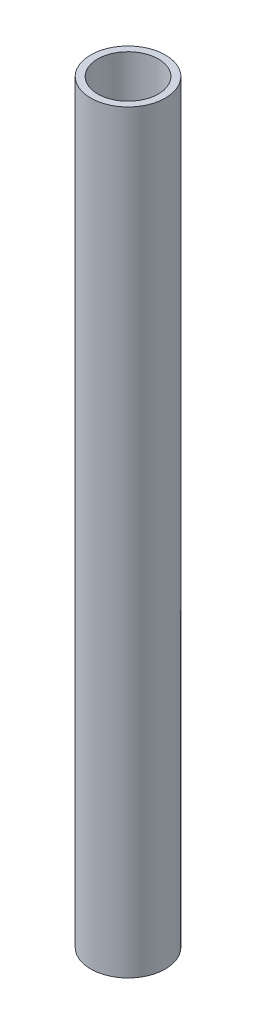
ISO-10303-21;
HEADER;
FILE_DESCRIPTION(('STEP AP214'),'2;1');
FILE_NAME('part.step','',(''),(''),'','','');
FILE_SCHEMA(('AUTOMOTIVE_DESIGN { 1 0 10303 214 1 1 1 1 }'));
ENDSEC;
DATA;
#1=APPLICATION_CONTEXT('core data for automotive mechanical design processes');
#2=APPLICATION_PROTOCOL_DEFINITION('international standard','automotive_design',2000,#1);
#3=PRODUCT_CONTEXT('',#1,'mechanical');
#4=PRODUCT('Part','Part','',(#3));
#5=PRODUCT_RELATED_PRODUCT_CATEGORY('part','',(#4));
#6=PRODUCT_DEFINITION_FORMATION('','',#4);
#7=PRODUCT_DEFINITION_CONTEXT('part definition',#1,'design');
#8=PRODUCT_DEFINITION('design','',#6,#7);
#9=PRODUCT_DEFINITION_SHAPE('','',#8);
#10=(LENGTH_UNIT() NAMED_UNIT(*) SI_UNIT(.MILLI.,.METRE.));
#11=(NAMED_UNIT(*) PLANE_ANGLE_UNIT() SI_UNIT($,.RADIAN.));
#12=(NAMED_UNIT(*) SI_UNIT($,.STERADIAN.) SOLID_ANGLE_UNIT());
#13=UNCERTAINTY_MEASURE_WITH_UNIT(LENGTH_MEASURE(1.E-05),#10,'distance_accuracy_value','');
#14=(GEOMETRIC_REPRESENTATION_CONTEXT(3) GLOBAL_UNCERTAINTY_ASSIGNED_CONTEXT((#13)) GLOBAL_UNIT_ASSIGNED_CONTEXT((#10,
#11,#12)) REPRESENTATION_CONTEXT('',''));
#15=CARTESIAN_POINT('',(0.,0.,0.));
#16=DIRECTION('',(0.,0.,1.));
#17=DIRECTION('',(1.,0.,0.));
#18=AXIS2_PLACEMENT_3D('',#15,#16,#17);
#19=CARTESIAN_POINT('',(0.,215.,1.50000000000001));
#20=DIRECTION('',(0.,1.,0.));
#21=DIRECTION('',(0.,0.,1.));
#22=AXIS2_PLACEMENT_3D('',#19,#20,#21);
#23=PLANE('',#22);
#24=CARTESIAN_POINT('',(0.,215.,1.50000000000001));
#25=DIRECTION('',(0.,1.,0.));
#26=DIRECTION('',(0.,0.,1.));
#27=AXIS2_PLACEMENT_3D('',#24,#25,#26);
#28=CIRCLE('',#27,10.65);
#29=CARTESIAN_POINT('',(0.,215.,-9.14999999999999));
#30=VERTEX_POINT('',#29);
#31=EDGE_CURVE('E10',#30,#30,#28,.T.);
#32=ORIENTED_EDGE('',*,*,#31,.T.);
#33=EDGE_LOOP('',(#32));
#34=FACE_BOUND('',#33,.T.);
#35=CARTESIAN_POINT('',(0.,215.,1.50000000000001));
#36=DIRECTION('',(0.,1.,0.));
#37=DIRECTION('',(0.,0.,1.));
#38=AXIS2_PLACEMENT_3D('',#35,#36,#37);
#39=CIRCLE('',#38,8.65);
#40=CARTESIAN_POINT('',(0.,215.,-7.14999999999999));
#41=VERTEX_POINT('',#40);
#42=EDGE_CURVE('E44',#41,#41,#39,.T.);
#43=ORIENTED_EDGE('',*,*,#42,.F.);
#44=EDGE_LOOP('',(#43));
#45=FACE_BOUND('',#44,.T.);
#46=ADVANCED_FACE('F33',(#34,#45),#23,.T.);
#47=CARTESIAN_POINT('',(0.,0.,1.50000000000001));
#48=DIRECTION('',(0.,1.,0.));
#49=DIRECTION('',(0.,0.,1.));
#50=AXIS2_PLACEMENT_3D('',#47,#48,#49);
#51=PLANE('',#50);
#52=CARTESIAN_POINT('',(0.,0.,1.50000000000001));
#53=DIRECTION('',(0.,1.,0.));
#54=DIRECTION('',(0.,0.,1.));
#55=AXIS2_PLACEMENT_3D('',#52,#53,#54);
#56=CIRCLE('',#55,10.65);
#57=CARTESIAN_POINT('',(0.,0.,-9.14999999999999));
#58=VERTEX_POINT('',#57);
#59=EDGE_CURVE('E37',#58,#58,#56,.T.);
#60=ORIENTED_EDGE('',*,*,#59,.F.);
#61=EDGE_LOOP('',(#60));
#62=FACE_BOUND('',#61,.T.);
#63=CARTESIAN_POINT('',(0.,0.,1.50000000000001));
#64=DIRECTION('',(0.,1.,0.));
#65=DIRECTION('',(0.,0.,1.));
#66=AXIS2_PLACEMENT_3D('',#63,#64,#65);
#67=CIRCLE('',#66,8.65);
#68=CARTESIAN_POINT('',(0.,0.,-7.14999999999999));
#69=VERTEX_POINT('',#68);
#70=EDGE_CURVE('E46',#69,#69,#67,.T.);
#71=ORIENTED_EDGE('',*,*,#70,.T.);
#72=EDGE_LOOP('',(#71));
#73=FACE_BOUND('',#72,.T.);
#74=ADVANCED_FACE('F56',(#62,#73),#51,.F.);
#75=CARTESIAN_POINT('',(0.,215.,1.50000000000001));
#76=DIRECTION('',(0.,-1.,0.));
#77=DIRECTION('',(0.,0.,-1.));
#78=AXIS2_PLACEMENT_3D('',#75,#76,#77);
#79=CYLINDRICAL_SURFACE('',#78,10.65);
#80=CARTESIAN_POINT('',(0.,215.,-9.14999999999999));
#81=CARTESIAN_POINT('',(0.,212.760416666667,-9.14999999999999));
#82=CARTESIAN_POINT('',(0.,210.520833333333,-9.14999999999999));
#83=CARTESIAN_POINT('',(0.,206.041666666667,-9.14999999999999));
#84=CARTESIAN_POINT('',(0.,203.802083333333,-9.14999999999999));
#85=CARTESIAN_POINT('',(0.,199.322916666667,-9.14999999999999));
#86=CARTESIAN_POINT('',(0.,197.083333333333,-9.14999999999999));
#87=CARTESIAN_POINT('',(0.,192.604166666667,-9.14999999999999));
#88=CARTESIAN_POINT('',(0.,190.364583333333,-9.14999999999999));
#89=CARTESIAN_POINT('',(0.,185.885416666667,-9.14999999999999));
#90=CARTESIAN_POINT('',(0.,183.645833333333,-9.14999999999999));
#91=CARTESIAN_POINT('',(0.,179.166666666667,-9.14999999999999));
#92=CARTESIAN_POINT('',(0.,176.927083333333,-9.14999999999999));
#93=CARTESIAN_POINT('',(0.,172.447916666667,-9.14999999999999));
#94=CARTESIAN_POINT('',(0.,170.208333333333,-9.14999999999999));
#95=CARTESIAN_POINT('',(0.,165.729166666667,-9.14999999999999));
#96=CARTESIAN_POINT('',(0.,163.489583333333,-9.14999999999999));
#97=CARTESIAN_POINT('',(0.,159.010416666667,-9.14999999999999));
#98=CARTESIAN_POINT('',(0.,156.770833333333,-9.14999999999999));
#99=CARTESIAN_POINT('',(0.,152.291666666667,-9.14999999999999));
#100=CARTESIAN_POINT('',(0.,150.052083333333,-9.14999999999999));
#101=CARTESIAN_POINT('',(0.,145.572916666667,-9.14999999999999));
#102=CARTESIAN_POINT('',(0.,143.333333333333,-9.14999999999999));
#103=CARTESIAN_POINT('',(0.,138.854166666667,-9.14999999999999));
#104=CARTESIAN_POINT('',(0.,136.614583333333,-9.14999999999999));
#105=CARTESIAN_POINT('',(0.,132.135416666667,-9.14999999999999));
#106=CARTESIAN_POINT('',(0.,129.895833333333,-9.14999999999999));
#107=CARTESIAN_POINT('',(0.,125.416666666667,-9.14999999999999));
#108=CARTESIAN_POINT('',(0.,123.177083333333,-9.14999999999999));
#109=CARTESIAN_POINT('',(0.,118.697916666667,-9.14999999999999));
#110=CARTESIAN_POINT('',(0.,116.458333333333,-9.14999999999999));
#111=CARTESIAN_POINT('',(0.,111.979166666667,-9.14999999999999));
#112=CARTESIAN_POINT('',(0.,109.739583333333,-9.14999999999999));
#113=CARTESIAN_POINT('',(0.,105.260416666667,-9.14999999999999));
#114=CARTESIAN_POINT('',(0.,103.020833333333,-9.14999999999999));
#115=CARTESIAN_POINT('',(0.,98.5416666666666,-9.14999999999999));
#116=CARTESIAN_POINT('',(0.,96.3020833333333,-9.14999999999999));
#117=CARTESIAN_POINT('',(0.,91.8229166666666,-9.14999999999999));
#118=CARTESIAN_POINT('',(0.,89.5833333333333,-9.14999999999999));
#119=CARTESIAN_POINT('',(0.,85.1041666666666,-9.14999999999999));
#120=CARTESIAN_POINT('',(0.,82.8645833333333,-9.14999999999999));
#121=CARTESIAN_POINT('',(0.,78.3854166666666,-9.14999999999999));
#122=CARTESIAN_POINT('',(0.,76.1458333333333,-9.14999999999999));
#123=CARTESIAN_POINT('',(0.,71.6666666666666,-9.14999999999999));
#124=CARTESIAN_POINT('',(0.,69.4270833333333,-9.14999999999999));
#125=CARTESIAN_POINT('',(0.,64.9479166666666,-9.14999999999999));
#126=CARTESIAN_POINT('',(0.,62.7083333333333,-9.14999999999999));
#127=CARTESIAN_POINT('',(0.,58.2291666666667,-9.14999999999999));
#128=CARTESIAN_POINT('',(0.,55.9895833333333,-9.14999999999999));
#129=CARTESIAN_POINT('',(0.,51.5104166666667,-9.14999999999999));
#130=CARTESIAN_POINT('',(0.,49.2708333333333,-9.14999999999999));
#131=CARTESIAN_POINT('',(0.,44.7916666666666,-9.14999999999999));
#132=CARTESIAN_POINT('',(0.,42.5520833333333,-9.14999999999999));
#133=CARTESIAN_POINT('',(0.,38.0729166666666,-9.14999999999999));
#134=CARTESIAN_POINT('',(0.,35.8333333333333,-9.14999999999999));
#135=CARTESIAN_POINT('',(0.,31.3541666666666,-9.14999999999999));
#136=CARTESIAN_POINT('',(0.,29.1145833333333,-9.14999999999999));
#137=CARTESIAN_POINT('',(0.,24.6354166666667,-9.14999999999999));
#138=CARTESIAN_POINT('',(0.,22.3958333333333,-9.14999999999999));
#139=CARTESIAN_POINT('',(0.,17.9166666666666,-9.14999999999999));
#140=CARTESIAN_POINT('',(0.,15.6770833333333,-9.14999999999999));
#141=CARTESIAN_POINT('',(0.,11.1979166666666,-9.14999999999999));
#142=CARTESIAN_POINT('',(0.,8.9583333333333,-9.14999999999999));
#143=CARTESIAN_POINT('',(0.,4.47916666666664,-9.14999999999999));
#144=CARTESIAN_POINT('',(0.,2.23958333333331,-9.14999999999999));
#145=CARTESIAN_POINT('',(0.,0.,-9.14999999999999));
#146=B_SPLINE_CURVE_WITH_KNOTS('',3,(#80,#81,#82,#83,#84,#85,#86,#87,#88,#89,#90,#91,#92,#93,
#94,#95,#96,#97,#98,#99,#100,#101,#102,#103,#104,#105,#106,#107,#108,#109,#110,#111,#112,#113,
#114,#115,#116,#117,#118,#119,#120,#121,#122,#123,#124,#125,#126,#127,#128,#129,#130,#131,#132,
#133,#134,#135,#136,#137,#138,#139,#140,#141,#142,#143,#144,#145),.UNSPECIFIED.,.F.,.F.,(4,2,2,
2,2,2,2,2,2,2,2,2,2,2,2,2,2,2,2,2,2,2,2,2,2,2,2,2,2,2,2,2,4),(0.,6.71875000000002,13.4375,
20.15625,26.875,33.59375,40.3125,47.03125,53.75,60.46875,67.1875,73.90625,80.625,87.34375,
94.0625,100.78125,107.5,114.21875,120.9375,127.65625,134.375,141.09375,147.8125,154.53125,
161.25,167.96875,174.6875,181.40625,188.125,194.84375,201.5625,208.28125,215.),.UNSPECIFIED.);
#147=EDGE_CURVE('BSEAM35',#30,#58,#146,.T.);
#148=ORIENTED_EDGE('',*,*,#31,.F.);
#149=ORIENTED_EDGE('',*,*,#59,.T.);
#150=ORIENTED_EDGE('',*,*,#147,.T.);
#151=ORIENTED_EDGE('',*,*,#147,.F.);
#152=EDGE_LOOP('',(#148,#150,#149,#151));
#153=FACE_BOUND('',#152,.T.);
#154=ADVANCED_FACE('F35',(#153),#79,.T.);
#155=CARTESIAN_POINT('',(0.,215.,1.50000000000001));
#156=DIRECTION('',(0.,-1.,0.));
#157=DIRECTION('',(0.,0.,-1.));
#158=AXIS2_PLACEMENT_3D('',#155,#156,#157);
#159=CYLINDRICAL_SURFACE('',#158,8.65);
#160=CARTESIAN_POINT('',(0.,215.,-7.14999999999999));
#161=CARTESIAN_POINT('',(0.,212.760416666667,-7.14999999999999));
#162=CARTESIAN_POINT('',(0.,210.520833333333,-7.14999999999999));
#163=CARTESIAN_POINT('',(0.,206.041666666667,-7.14999999999999));
#164=CARTESIAN_POINT('',(0.,203.802083333333,-7.14999999999999));
#165=CARTESIAN_POINT('',(0.,199.322916666667,-7.14999999999999));
#166=CARTESIAN_POINT('',(0.,197.083333333333,-7.14999999999999));
#167=CARTESIAN_POINT('',(0.,192.604166666667,-7.14999999999999));
#168=CARTESIAN_POINT('',(0.,190.364583333333,-7.14999999999999));
#169=CARTESIAN_POINT('',(0.,185.885416666667,-7.14999999999999));
#170=CARTESIAN_POINT('',(0.,183.645833333333,-7.14999999999999));
#171=CARTESIAN_POINT('',(0.,179.166666666667,-7.14999999999999));
#172=CARTESIAN_POINT('',(0.,176.927083333333,-7.14999999999999));
#173=CARTESIAN_POINT('',(0.,172.447916666667,-7.14999999999999));
#174=CARTESIAN_POINT('',(0.,170.208333333333,-7.14999999999999));
#175=CARTESIAN_POINT('',(0.,165.729166666667,-7.14999999999999));
#176=CARTESIAN_POINT('',(0.,163.489583333333,-7.14999999999999));
#177=CARTESIAN_POINT('',(0.,159.010416666667,-7.14999999999999));
#178=CARTESIAN_POINT('',(0.,156.770833333333,-7.14999999999999));
#179=CARTESIAN_POINT('',(0.,152.291666666667,-7.14999999999999));
#180=CARTESIAN_POINT('',(0.,150.052083333333,-7.14999999999999));
#181=CARTESIAN_POINT('',(0.,145.572916666667,-7.14999999999999));
#182=CARTESIAN_POINT('',(0.,143.333333333333,-7.14999999999999));
#183=CARTESIAN_POINT('',(0.,138.854166666667,-7.14999999999999));
#184=CARTESIAN_POINT('',(0.,136.614583333333,-7.14999999999999));
#185=CARTESIAN_POINT('',(0.,132.135416666667,-7.14999999999999));
#186=CARTESIAN_POINT('',(0.,129.895833333333,-7.14999999999999));
#187=CARTESIAN_POINT('',(0.,125.416666666667,-7.14999999999999));
#188=CARTESIAN_POINT('',(0.,123.177083333333,-7.14999999999999));
#189=CARTESIAN_POINT('',(0.,118.697916666667,-7.14999999999999));
#190=CARTESIAN_POINT('',(0.,116.458333333333,-7.14999999999999));
#191=CARTESIAN_POINT('',(0.,111.979166666667,-7.14999999999999));
#192=CARTESIAN_POINT('',(0.,109.739583333333,-7.14999999999999));
#193=CARTESIAN_POINT('',(0.,105.260416666667,-7.14999999999999));
#194=CARTESIAN_POINT('',(0.,103.020833333333,-7.14999999999999));
#195=CARTESIAN_POINT('',(0.,98.5416666666666,-7.14999999999999));
#196=CARTESIAN_POINT('',(0.,96.3020833333333,-7.14999999999999));
#197=CARTESIAN_POINT('',(0.,91.8229166666666,-7.14999999999999));
#198=CARTESIAN_POINT('',(0.,89.5833333333333,-7.14999999999999));
#199=CARTESIAN_POINT('',(0.,85.1041666666666,-7.14999999999999));
#200=CARTESIAN_POINT('',(0.,82.8645833333333,-7.14999999999999));
#201=CARTESIAN_POINT('',(0.,78.3854166666666,-7.14999999999999));
#202=CARTESIAN_POINT('',(0.,76.1458333333333,-7.14999999999999));
#203=CARTESIAN_POINT('',(0.,71.6666666666666,-7.14999999999999));
#204=CARTESIAN_POINT('',(0.,69.4270833333333,-7.14999999999999));
#205=CARTESIAN_POINT('',(0.,64.9479166666666,-7.14999999999999));
#206=CARTESIAN_POINT('',(0.,62.7083333333333,-7.14999999999999));
#207=CARTESIAN_POINT('',(0.,58.2291666666667,-7.14999999999999));
#208=CARTESIAN_POINT('',(0.,55.9895833333333,-7.14999999999999));
#209=CARTESIAN_POINT('',(0.,51.5104166666667,-7.14999999999999));
#210=CARTESIAN_POINT('',(0.,49.2708333333333,-7.14999999999999));
#211=CARTESIAN_POINT('',(0.,44.7916666666666,-7.14999999999999));
#212=CARTESIAN_POINT('',(0.,42.5520833333333,-7.14999999999999));
#213=CARTESIAN_POINT('',(0.,38.0729166666666,-7.14999999999999));
#214=CARTESIAN_POINT('',(0.,35.8333333333333,-7.14999999999999));
#215=CARTESIAN_POINT('',(0.,31.3541666666666,-7.14999999999999));
#216=CARTESIAN_POINT('',(0.,29.1145833333333,-7.14999999999999));
#217=CARTESIAN_POINT('',(0.,24.6354166666667,-7.14999999999999));
#218=CARTESIAN_POINT('',(0.,22.3958333333333,-7.14999999999999));
#219=CARTESIAN_POINT('',(0.,17.9166666666666,-7.14999999999999));
#220=CARTESIAN_POINT('',(0.,15.6770833333333,-7.14999999999999));
#221=CARTESIAN_POINT('',(0.,11.1979166666666,-7.14999999999999));
#222=CARTESIAN_POINT('',(0.,8.9583333333333,-7.14999999999999));
#223=CARTESIAN_POINT('',(0.,4.47916666666664,-7.14999999999999));
#224=CARTESIAN_POINT('',(0.,2.23958333333331,-7.14999999999999));
#225=CARTESIAN_POINT('',(0.,0.,-7.14999999999999));
#226=B_SPLINE_CURVE_WITH_KNOTS('',3,(#160,#161,#162,#163,#164,#165,#166,#167,#168,#169,#170,
#171,#172,#173,#174,#175,#176,#177,#178,#179,#180,#181,#182,#183,#184,#185,#186,#187,#188,#189,
#190,#191,#192,#193,#194,#195,#196,#197,#198,#199,#200,#201,#202,#203,#204,#205,#206,#207,#208,
#209,#210,#211,#212,#213,#214,#215,#216,#217,#218,#219,#220,#221,#222,#223,#224,#225),
.UNSPECIFIED.,.F.,.F.,(4,2,2,2,2,2,2,2,2,2,2,2,2,2,2,2,2,2,2,2,2,2,2,2,2,2,2,2,2,2,2,2,4),(0.,
6.71875000000002,13.4375,20.15625,26.875,33.59375,40.3125,47.03125,53.75,60.46875,67.1875,
73.90625,80.625,87.34375,94.0625,100.78125,107.5,114.21875,120.9375,127.65625,134.375,141.09375,
147.8125,154.53125,161.25,167.96875,174.6875,181.40625,188.125,194.84375,201.5625,208.28125,
215.),.UNSPECIFIED.);
#227=EDGE_CURVE('BSEAM52',#41,#69,#226,.T.);
#228=ORIENTED_EDGE('',*,*,#42,.T.);
#229=ORIENTED_EDGE('',*,*,#70,.F.);
#230=ORIENTED_EDGE('',*,*,#227,.T.);
#231=ORIENTED_EDGE('',*,*,#227,.F.);
#232=EDGE_LOOP('',(#228,#230,#229,#231));
#233=FACE_BOUND('',#232,.T.);
#234=ADVANCED_FACE('F52',(#233),#159,.F.);
#235=CLOSED_SHELL('',(#46,#74,#154,#234));
#236=MANIFOLD_SOLID_BREP('B2',#235);
#237=ADVANCED_BREP_SHAPE_REPRESENTATION('',(#18,#236),#14);
#238=SHAPE_DEFINITION_REPRESENTATION(#9,#237);
ENDSEC;
END-ISO-10303-21;
